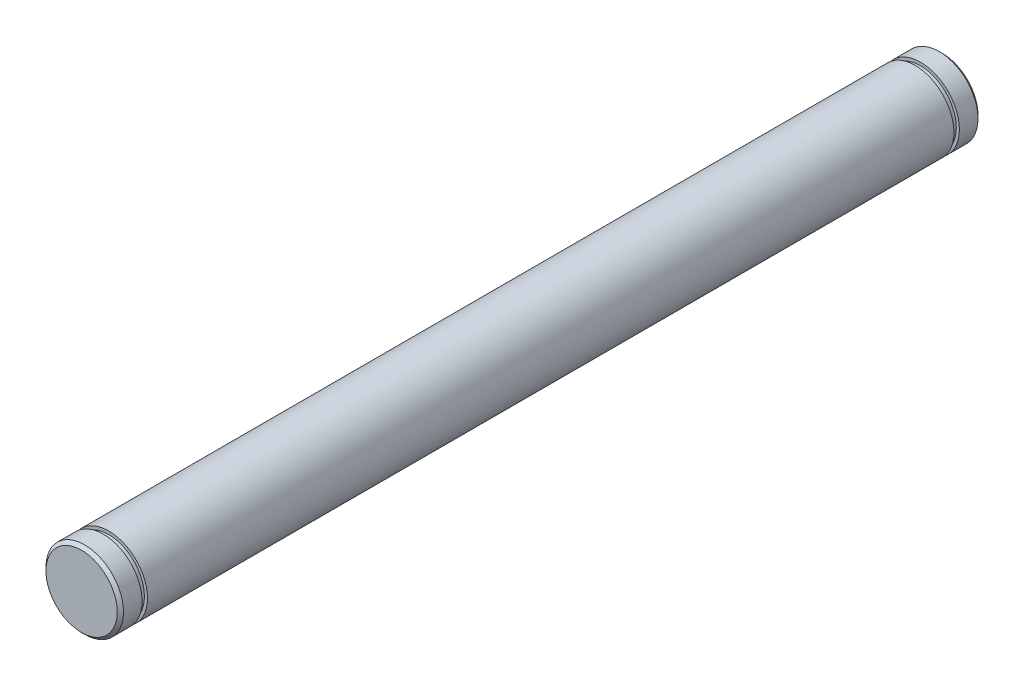
ISO-10303-21;
HEADER;
FILE_DESCRIPTION(('STEP AP214'),'2;1');
FILE_NAME('part.step','',(''),(''),'','','');
FILE_SCHEMA(('AUTOMOTIVE_DESIGN { 1 0 10303 214 1 1 1 1 }'));
ENDSEC;
DATA;
#1=APPLICATION_CONTEXT('core data for automotive mechanical design processes');
#2=APPLICATION_PROTOCOL_DEFINITION('international standard','automotive_design',2000,#1);
#3=PRODUCT_CONTEXT('',#1,'mechanical');
#4=PRODUCT('Part','Part','',(#3));
#5=PRODUCT_RELATED_PRODUCT_CATEGORY('part','',(#4));
#6=PRODUCT_DEFINITION_FORMATION('','',#4);
#7=PRODUCT_DEFINITION_CONTEXT('part definition',#1,'design');
#8=PRODUCT_DEFINITION('design','',#6,#7);
#9=PRODUCT_DEFINITION_SHAPE('','',#8);
#10=(LENGTH_UNIT() NAMED_UNIT(*) SI_UNIT(.MILLI.,.METRE.));
#11=(NAMED_UNIT(*) PLANE_ANGLE_UNIT() SI_UNIT($,.RADIAN.));
#12=(NAMED_UNIT(*) SI_UNIT($,.STERADIAN.) SOLID_ANGLE_UNIT());
#13=UNCERTAINTY_MEASURE_WITH_UNIT(LENGTH_MEASURE(1.E-05),#10,'distance_accuracy_value','');
#14=(GEOMETRIC_REPRESENTATION_CONTEXT(3) GLOBAL_UNCERTAINTY_ASSIGNED_CONTEXT((#13)) GLOBAL_UNIT_ASSIGNED_CONTEXT((#10,
#11,#12)) REPRESENTATION_CONTEXT('',''));
#15=CARTESIAN_POINT('',(0.,0.,0.));
#16=DIRECTION('',(0.,0.,1.));
#17=DIRECTION('',(1.,0.,0.));
#18=AXIS2_PLACEMENT_3D('',#15,#16,#17);
#19=CARTESIAN_POINT('',(0.,0.,27.75));
#20=DIRECTION('',(0.,0.,-1.));
#21=DIRECTION('',(-1.,0.,0.));
#22=AXIS2_PLACEMENT_3D('',#19,#20,#21);
#23=CYLINDRICAL_SURFACE('',#22,2.5);
#24=CARTESIAN_POINT('',(0.,0.,26.));
#25=DIRECTION('',(0.,0.,1.));
#26=DIRECTION('',(1.,0.,0.));
#27=AXIS2_PLACEMENT_3D('',#24,#25,#26);
#28=CIRCLE('',#27,2.5);
#29=CARTESIAN_POINT('',(2.5,0.,26.));
#30=VERTEX_POINT('',#29);
#31=EDGE_CURVE('E57',#30,#30,#28,.T.);
#32=ORIENTED_EDGE('',*,*,#31,.F.);
#33=EDGE_LOOP('',(#32));
#34=FACE_BOUND('',#33,.T.);
#35=CARTESIAN_POINT('',(0.,0.,-26.));
#36=DIRECTION('',(0.,0.,1.));
#37=DIRECTION('',(1.,0.,0.));
#38=AXIS2_PLACEMENT_3D('',#35,#36,#37);
#39=CIRCLE('',#38,2.5);
#40=CARTESIAN_POINT('',(2.5,0.,-26.));
#41=VERTEX_POINT('',#40);
#42=EDGE_CURVE('E72',#41,#41,#39,.T.);
#43=ORIENTED_EDGE('',*,*,#42,.T.);
#44=EDGE_LOOP('',(#43));
#45=FACE_BOUND('',#44,.T.);
#46=ADVANCED_FACE('F31',(#34,#45),#23,.T.);
#47=CARTESIAN_POINT('',(0.,0.,27.55));
#48=DIRECTION('',(0.,0.,1.));
#49=DIRECTION('',(1.,0.,0.));
#50=AXIS2_PLACEMENT_3D('',#47,#48,#49);
#51=CIRCLE('',#50,2.5);
#52=CARTESIAN_POINT('',(2.5,0.,27.55));
#53=VERTEX_POINT('',#52);
#54=EDGE_CURVE('E10',#53,#53,#51,.F.);
#55=ORIENTED_EDGE('',*,*,#54,.T.);
#56=EDGE_LOOP('',(#55));
#57=FACE_BOUND('',#56,.T.);
#58=CARTESIAN_POINT('',(0.,0.,26.35));
#59=DIRECTION('',(0.,0.,1.));
#60=DIRECTION('',(1.,0.,0.));
#61=AXIS2_PLACEMENT_3D('',#58,#59,#60);
#62=CIRCLE('',#61,2.5);
#63=CARTESIAN_POINT('',(2.5,0.,26.35));
#64=VERTEX_POINT('',#63);
#65=EDGE_CURVE('E60',#64,#64,#62,.T.);
#66=ORIENTED_EDGE('',*,*,#65,.T.);
#67=EDGE_LOOP('',(#66));
#68=FACE_BOUND('',#67,.T.);
#69=ADVANCED_FACE('F94',(#57,#68),#23,.T.);
#70=CARTESIAN_POINT('',(0.,0.,27.75));
#71=DIRECTION('',(0.,0.,1.));
#72=DIRECTION('',(1.,0.,0.));
#73=AXIS2_PLACEMENT_3D('',#70,#71,#72);
#74=PLANE('',#73);
#75=CARTESIAN_POINT('',(0.,0.,27.75));
#76=DIRECTION('',(0.,0.,1.));
#77=DIRECTION('',(1.,0.,0.));
#78=AXIS2_PLACEMENT_3D('',#75,#76,#77);
#79=CIRCLE('',#78,2.30000000000001);
#80=CARTESIAN_POINT('',(2.30000000000001,0.,27.75));
#81=VERTEX_POINT('',#80);
#82=EDGE_CURVE('E38',#81,#81,#79,.T.);
#83=ORIENTED_EDGE('',*,*,#82,.T.);
#84=EDGE_LOOP('',(#83));
#85=FACE_BOUND('',#84,.T.);
#86=ADVANCED_FACE('F101',(#85),#74,.T.);
#87=CARTESIAN_POINT('',(0.,2.5,26.35));
#88=DIRECTION('',(0.,0.,-1.));
#89=DIRECTION('',(-1.,0.,0.));
#90=AXIS2_PLACEMENT_3D('',#87,#88,#89);
#91=PLANE('',#90);
#92=CARTESIAN_POINT('',(0.,0.,26.35));
#93=DIRECTION('',(0.,0.,1.));
#94=DIRECTION('',(1.,0.,0.));
#95=AXIS2_PLACEMENT_3D('',#92,#93,#94);
#96=CIRCLE('',#95,2.3);
#97=CARTESIAN_POINT('',(2.3,0.,26.35));
#98=VERTEX_POINT('',#97);
#99=EDGE_CURVE('E51',#98,#98,#96,.T.);
#100=ORIENTED_EDGE('',*,*,#99,.T.);
#101=EDGE_LOOP('',(#100));
#102=FACE_BOUND('',#101,.T.);
#103=ORIENTED_EDGE('',*,*,#65,.F.);
#104=EDGE_LOOP('',(#103));
#105=FACE_BOUND('',#104,.T.);
#106=ADVANCED_FACE('F183',(#102,#105),#91,.T.);
#107=CARTESIAN_POINT('',(0.,0.,27.75));
#108=DIRECTION('',(0.,0.,1.));
#109=DIRECTION('',(1.,0.,0.));
#110=AXIS2_PLACEMENT_3D('',#107,#108,#109);
#111=CYLINDRICAL_SURFACE('',#110,2.3);
#112=CARTESIAN_POINT('',(0.,0.,26.));
#113=DIRECTION('',(0.,0.,1.));
#114=DIRECTION('',(1.,0.,0.));
#115=AXIS2_PLACEMENT_3D('',#112,#113,#114);
#116=CIRCLE('',#115,2.3);
#117=CARTESIAN_POINT('',(2.3,0.,26.));
#118=VERTEX_POINT('',#117);
#119=EDGE_CURVE('E54',#118,#118,#116,.T.);
#120=ORIENTED_EDGE('',*,*,#119,.T.);
#121=EDGE_LOOP('',(#120));
#122=FACE_BOUND('',#121,.T.);
#123=ORIENTED_EDGE('',*,*,#99,.F.);
#124=EDGE_LOOP('',(#123));
#125=FACE_BOUND('',#124,.T.);
#126=ADVANCED_FACE('F90',(#122,#125),#111,.T.);
#127=CARTESIAN_POINT('',(0.,2.5,26.));
#128=DIRECTION('',(0.,0.,1.));
#129=DIRECTION('',(1.,0.,0.));
#130=AXIS2_PLACEMENT_3D('',#127,#128,#129);
#131=PLANE('',#130);
#132=ORIENTED_EDGE('',*,*,#31,.T.);
#133=EDGE_LOOP('',(#132));
#134=FACE_BOUND('',#133,.T.);
#135=ORIENTED_EDGE('',*,*,#119,.F.);
#136=EDGE_LOOP('',(#135));
#137=FACE_BOUND('',#136,.T.);
#138=ADVANCED_FACE('F80',(#134,#137),#131,.T.);
#139=CARTESIAN_POINT('',(0.,2.5,-26.));
#140=DIRECTION('',(0.,0.,-1.));
#141=DIRECTION('',(-1.,0.,0.));
#142=AXIS2_PLACEMENT_3D('',#139,#140,#141);
#143=PLANE('',#142);
#144=CARTESIAN_POINT('',(0.,0.,-26.));
#145=DIRECTION('',(0.,0.,1.));
#146=DIRECTION('',(1.,0.,0.));
#147=AXIS2_PLACEMENT_3D('',#144,#145,#146);
#148=CIRCLE('',#147,2.3);
#149=CARTESIAN_POINT('',(2.3,0.,-26.));
#150=VERTEX_POINT('',#149);
#151=EDGE_CURVE('E63',#150,#150,#148,.T.);
#152=ORIENTED_EDGE('',*,*,#151,.T.);
#153=EDGE_LOOP('',(#152));
#154=FACE_BOUND('',#153,.T.);
#155=ORIENTED_EDGE('',*,*,#42,.F.);
#156=EDGE_LOOP('',(#155));
#157=FACE_BOUND('',#156,.T.);
#158=ADVANCED_FACE('F77',(#154,#157),#143,.T.);
#159=CARTESIAN_POINT('',(0.,0.,27.75));
#160=DIRECTION('',(0.,0.,1.));
#161=DIRECTION('',(1.,0.,0.));
#162=AXIS2_PLACEMENT_3D('',#159,#160,#161);
#163=CYLINDRICAL_SURFACE('',#162,2.3);
#164=CARTESIAN_POINT('',(0.,0.,-26.35));
#165=DIRECTION('',(0.,0.,1.));
#166=DIRECTION('',(1.,0.,0.));
#167=AXIS2_PLACEMENT_3D('',#164,#165,#166);
#168=CIRCLE('',#167,2.3);
#169=CARTESIAN_POINT('',(2.3,0.,-26.35));
#170=VERTEX_POINT('',#169);
#171=EDGE_CURVE('E66',#170,#170,#168,.T.);
#172=ORIENTED_EDGE('',*,*,#171,.T.);
#173=EDGE_LOOP('',(#172));
#174=FACE_BOUND('',#173,.T.);
#175=ORIENTED_EDGE('',*,*,#151,.F.);
#176=EDGE_LOOP('',(#175));
#177=FACE_BOUND('',#176,.T.);
#178=ADVANCED_FACE('F79',(#174,#177),#163,.T.);
#179=CARTESIAN_POINT('',(0.,2.5,-26.35));
#180=DIRECTION('',(0.,0.,1.));
#181=DIRECTION('',(1.,0.,0.));
#182=AXIS2_PLACEMENT_3D('',#179,#180,#181);
#183=PLANE('',#182);
#184=CARTESIAN_POINT('',(0.,0.,-26.35));
#185=DIRECTION('',(0.,0.,1.));
#186=DIRECTION('',(1.,0.,0.));
#187=AXIS2_PLACEMENT_3D('',#184,#185,#186);
#188=CIRCLE('',#187,2.5);
#189=CARTESIAN_POINT('',(2.5,0.,-26.35));
#190=VERTEX_POINT('',#189);
#191=EDGE_CURVE('E69',#190,#190,#188,.T.);
#192=ORIENTED_EDGE('',*,*,#191,.T.);
#193=EDGE_LOOP('',(#192));
#194=FACE_BOUND('',#193,.T.);
#195=ORIENTED_EDGE('',*,*,#171,.F.);
#196=EDGE_LOOP('',(#195));
#197=FACE_BOUND('',#196,.T.);
#198=ADVANCED_FACE('F87',(#194,#197),#183,.T.);
#199=CARTESIAN_POINT('',(0.,0.,-27.75));
#200=DIRECTION('',(0.,0.,1.));
#201=DIRECTION('',(1.,0.,0.));
#202=AXIS2_PLACEMENT_3D('',#199,#200,#201);
#203=PLANE('',#202);
#204=CARTESIAN_POINT('',(0.,0.,-27.75));
#205=DIRECTION('',(0.,0.,1.));
#206=DIRECTION('',(1.,0.,0.));
#207=AXIS2_PLACEMENT_3D('',#204,#205,#206);
#208=CIRCLE('',#207,2.3);
#209=CARTESIAN_POINT('',(2.3,0.,-27.75));
#210=VERTEX_POINT('',#209);
#211=EDGE_CURVE('E42',#210,#210,#208,.F.);
#212=ORIENTED_EDGE('',*,*,#211,.T.);
#213=EDGE_LOOP('',(#212));
#214=FACE_BOUND('',#213,.T.);
#215=ADVANCED_FACE('F106',(#214),#203,.F.);
#216=CARTESIAN_POINT('',(0.,0.,-27.55));
#217=DIRECTION('',(0.,0.,1.));
#218=DIRECTION('',(1.,0.,0.));
#219=AXIS2_PLACEMENT_3D('',#216,#217,#218);
#220=CIRCLE('',#219,2.5);
#221=CARTESIAN_POINT('',(2.5,0.,-27.55));
#222=VERTEX_POINT('',#221);
#223=EDGE_CURVE('E46',#222,#222,#220,.T.);
#224=ORIENTED_EDGE('',*,*,#223,.T.);
#225=EDGE_LOOP('',(#224));
#226=FACE_BOUND('',#225,.T.);
#227=ORIENTED_EDGE('',*,*,#191,.F.);
#228=EDGE_LOOP('',(#227));
#229=FACE_BOUND('',#228,.T.);
#230=ADVANCED_FACE('F97',(#226,#229),#23,.T.);
#231=CARTESIAN_POINT('',(0.,0.,-27.55));
#232=DIRECTION('',(0.,0.,1.));
#233=DIRECTION('',(1.,0.,0.));
#234=AXIS2_PLACEMENT_3D('',#231,#232,#233);
#235=CONICAL_SURFACE('',#234,2.5,0.78539816339746);
#236=ORIENTED_EDGE('',*,*,#211,.F.);
#237=EDGE_LOOP('',(#236));
#238=FACE_BOUND('',#237,.T.);
#239=ORIENTED_EDGE('',*,*,#223,.F.);
#240=EDGE_LOOP('',(#239));
#241=FACE_BOUND('',#240,.T.);
#242=ADVANCED_FACE('F105',(#238,#241),#235,.T.);
#243=CARTESIAN_POINT('',(0.,0.,27.75));
#244=DIRECTION('',(0.,0.,-1.));
#245=DIRECTION('',(-1.,0.,0.));
#246=AXIS2_PLACEMENT_3D('',#243,#244,#245);
#247=CONICAL_SURFACE('',#246,2.30000000000001,0.785398163397434);
#248=ORIENTED_EDGE('',*,*,#54,.F.);
#249=EDGE_LOOP('',(#248));
#250=FACE_BOUND('',#249,.T.);
#251=ORIENTED_EDGE('',*,*,#82,.F.);
#252=EDGE_LOOP('',(#251));
#253=FACE_BOUND('',#252,.T.);
#254=ADVANCED_FACE('F33',(#250,#253),#247,.T.);
#255=CLOSED_SHELL('',(#46,#69,#86,#106,#126,#138,#158,#178,#198,#215,#230,#242,#254));
#256=MANIFOLD_SOLID_BREP('B2',#255);
#257=ADVANCED_BREP_SHAPE_REPRESENTATION('',(#18,#256),#14);
#258=SHAPE_DEFINITION_REPRESENTATION(#9,#257);
ENDSEC;
END-ISO-10303-21;
